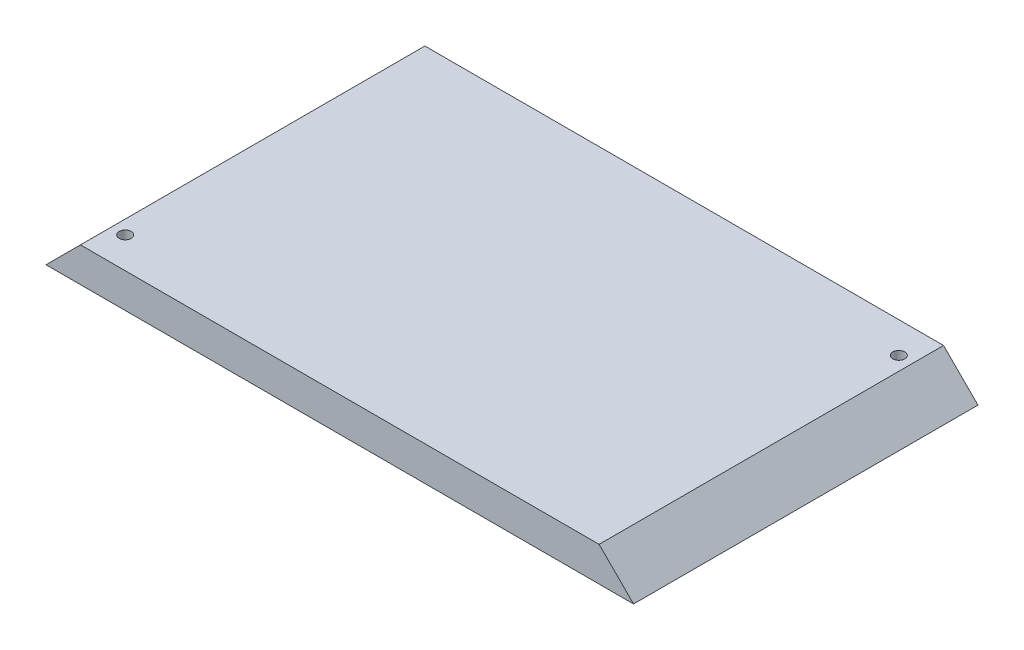
ISO-10303-21;
HEADER;
FILE_DESCRIPTION(('STEP AP214'),'2;1');
FILE_NAME('part.step','',(''),(''),'','','');
FILE_SCHEMA(('AUTOMOTIVE_DESIGN { 1 0 10303 214 1 1 1 1 }'));
ENDSEC;
DATA;
#1=APPLICATION_CONTEXT('core data for automotive mechanical design processes');
#2=APPLICATION_PROTOCOL_DEFINITION('international standard','automotive_design',2000,#1);
#3=PRODUCT_CONTEXT('',#1,'mechanical');
#4=PRODUCT('Part','Part','',(#3));
#5=PRODUCT_RELATED_PRODUCT_CATEGORY('part','',(#4));
#6=PRODUCT_DEFINITION_FORMATION('','',#4);
#7=PRODUCT_DEFINITION_CONTEXT('part definition',#1,'design');
#8=PRODUCT_DEFINITION('design','',#6,#7);
#9=PRODUCT_DEFINITION_SHAPE('','',#8);
#10=(LENGTH_UNIT() NAMED_UNIT(*) SI_UNIT(.MILLI.,.METRE.));
#11=(NAMED_UNIT(*) PLANE_ANGLE_UNIT() SI_UNIT($,.RADIAN.));
#12=(NAMED_UNIT(*) SI_UNIT($,.STERADIAN.) SOLID_ANGLE_UNIT());
#13=UNCERTAINTY_MEASURE_WITH_UNIT(LENGTH_MEASURE(1.E-05),#10,'distance_accuracy_value','');
#14=(GEOMETRIC_REPRESENTATION_CONTEXT(3) GLOBAL_UNCERTAINTY_ASSIGNED_CONTEXT((#13)) GLOBAL_UNIT_ASSIGNED_CONTEXT((#10,
#11,#12)) REPRESENTATION_CONTEXT('',''));
#15=CARTESIAN_POINT('',(0.,0.,0.));
#16=DIRECTION('',(0.,0.,1.));
#17=DIRECTION('',(1.,0.,0.));
#18=AXIS2_PLACEMENT_3D('',#15,#16,#17);
#19=CARTESIAN_POINT('',(-77.02528017,10.,-25.8878283702979));
#20=DIRECTION('',(-0.707106781186546,0.707106781186549,0.));
#21=DIRECTION('',(-0.707106781186549,-0.707106781186546,0.));
#22=AXIS2_PLACEMENT_3D('',#19,#20,#21);
#23=PLANE('',#22);
#24=DIRECTION('',(0.,0.,-1.));
#25=VECTOR('',#24,1.);
#26=CARTESIAN_POINT('',(-87.02528017,0.,-25.8878283702979));
#27=LINE('',#26,#25);
#28=CARTESIAN_POINT('',(-87.02528017,0.,-25.8878283702979));
#29=VERTEX_POINT('',#28);
#30=CARTESIAN_POINT('',(-87.02528017,0.,74.1121716297021));
#31=VERTEX_POINT('',#30);
#32=EDGE_CURVE('E100',#29,#31,#27,.F.);
#33=ORIENTED_EDGE('',*,*,#32,.T.);
#34=DIRECTION('',(0.707106781186549,0.707106781186546,0.));
#35=VECTOR('',#34,1.);
#36=CARTESIAN_POINT('',(-77.02528017,10.,74.1121716297021));
#37=LINE('',#36,#35);
#38=CARTESIAN_POINT('',(-77.02528017,10.,74.1121716297021));
#39=VERTEX_POINT('',#38);
#40=EDGE_CURVE('E11',#39,#31,#37,.F.);
#41=ORIENTED_EDGE('',*,*,#40,.F.);
#42=DIRECTION('',(0.,0.,1.));
#43=VECTOR('',#42,1.);
#44=CARTESIAN_POINT('',(-77.02528017,10.,-25.8878283702979));
#45=LINE('',#44,#43);
#46=CARTESIAN_POINT('',(-77.02528017,10.,-25.8878283702979));
#47=VERTEX_POINT('',#46);
#48=EDGE_CURVE('E81',#47,#39,#45,.T.);
#49=ORIENTED_EDGE('',*,*,#48,.F.);
#50=DIRECTION('',(0.707106781186549,0.707106781186546,0.));
#51=VECTOR('',#50,1.);
#52=CARTESIAN_POINT('',(-77.02528017,10.,-25.8878283702979));
#53=LINE('',#52,#51);
#54=EDGE_CURVE('E94',#47,#29,#53,.F.);
#55=ORIENTED_EDGE('',*,*,#54,.T.);
#56=EDGE_LOOP('',(#33,#41,#49,#55));
#57=FACE_BOUND('',#56,.T.);
#58=ADVANCED_FACE('F33',(#57),#23,.T.);
#59=CARTESIAN_POINT('',(-77.02528017,10.,74.1121716297021));
#60=DIRECTION('',(0.,0.,-1.));
#61=DIRECTION('',(-1.,0.,0.));
#62=AXIS2_PLACEMENT_3D('',#59,#60,#61);
#63=PLANE('',#62);
#64=DIRECTION('',(1.,0.,0.));
#65=VECTOR('',#64,1.);
#66=CARTESIAN_POINT('',(-77.02528017,0.,74.1121716297021));
#67=LINE('',#66,#65);
#68=CARTESIAN_POINT('',(83.5547198300001,0.,74.1121716297021));
#69=VERTEX_POINT('',#68);
#70=EDGE_CURVE('E87',#31,#69,#67,.T.);
#71=ORIENTED_EDGE('',*,*,#70,.T.);
#72=DIRECTION('',(-0.707106781186549,0.707106781186546,0.));
#73=VECTOR('',#72,1.);
#74=CARTESIAN_POINT('',(73.55471983,10.,74.1121716297021));
#75=LINE('',#74,#73);
#76=CARTESIAN_POINT('',(73.55471983,10.,74.1121716297021));
#77=VERTEX_POINT('',#76);
#78=EDGE_CURVE('E42',#77,#69,#75,.F.);
#79=ORIENTED_EDGE('',*,*,#78,.F.);
#80=DIRECTION('',(1.,0.,0.));
#81=VECTOR('',#80,1.);
#82=CARTESIAN_POINT('',(-77.02528017,10.,74.1121716297021));
#83=LINE('',#82,#81);
#84=EDGE_CURVE('E75',#39,#77,#83,.T.);
#85=ORIENTED_EDGE('',*,*,#84,.F.);
#86=ORIENTED_EDGE('',*,*,#40,.T.);
#87=EDGE_LOOP('',(#71,#79,#85,#86));
#88=FACE_BOUND('',#87,.T.);
#89=ADVANCED_FACE('F85',(#88),#63,.F.);
#90=CARTESIAN_POINT('',(73.55471983,10.,-25.8878283702979));
#91=DIRECTION('',(0.707106781186546,0.707106781186549,0.));
#92=DIRECTION('',(-0.707106781186549,0.707106781186546,0.));
#93=AXIS2_PLACEMENT_3D('',#90,#91,#92);
#94=PLANE('',#93);
#95=DIRECTION('',(0.,0.,1.));
#96=VECTOR('',#95,1.);
#97=CARTESIAN_POINT('',(83.55471983,0.,-25.8878283702979));
#98=LINE('',#97,#96);
#99=CARTESIAN_POINT('',(83.55471983,0.,-25.8878283702979));
#100=VERTEX_POINT('',#99);
#101=EDGE_CURVE('E99',#69,#100,#98,.F.);
#102=ORIENTED_EDGE('',*,*,#101,.T.);
#103=DIRECTION('',(-0.707106781186549,0.707106781186546,0.));
#104=VECTOR('',#103,1.);
#105=CARTESIAN_POINT('',(-1.73528017000028,85.29,-25.8878283702979));
#106=LINE('',#105,#104);
#107=CARTESIAN_POINT('',(73.55471983,10.,-25.8878283702979));
#108=VERTEX_POINT('',#107);
#109=EDGE_CURVE('E90',#108,#100,#106,.F.);
#110=ORIENTED_EDGE('',*,*,#109,.F.);
#111=DIRECTION('',(0.,0.,-1.));
#112=VECTOR('',#111,1.);
#113=CARTESIAN_POINT('',(73.55471983,10.,-25.8878283702979));
#114=LINE('',#113,#112);
#115=EDGE_CURVE('E78',#77,#108,#114,.T.);
#116=ORIENTED_EDGE('',*,*,#115,.F.);
#117=ORIENTED_EDGE('',*,*,#78,.T.);
#118=EDGE_LOOP('',(#102,#110,#116,#117));
#119=FACE_BOUND('',#118,.T.);
#120=ADVANCED_FACE('F92',(#119),#94,.T.);
#121=CARTESIAN_POINT('',(-77.02528017,10.,-25.8878283702979));
#122=DIRECTION('',(0.,0.,1.));
#123=DIRECTION('',(1.,0.,0.));
#124=AXIS2_PLACEMENT_3D('',#121,#122,#123);
#125=PLANE('',#124);
#126=DIRECTION('',(-1.,0.,0.));
#127=VECTOR('',#126,1.);
#128=CARTESIAN_POINT('',(-77.02528017,0.,-25.8878283702979));
#129=LINE('',#128,#127);
#130=EDGE_CURVE('E68',#100,#29,#129,.T.);
#131=ORIENTED_EDGE('',*,*,#130,.T.);
#132=ORIENTED_EDGE('',*,*,#54,.F.);
#133=DIRECTION('',(-1.,0.,0.));
#134=VECTOR('',#133,1.);
#135=CARTESIAN_POINT('',(-77.02528017,10.,-25.8878283702979));
#136=LINE('',#135,#134);
#137=EDGE_CURVE('E51',#108,#47,#136,.T.);
#138=ORIENTED_EDGE('',*,*,#137,.F.);
#139=ORIENTED_EDGE('',*,*,#109,.T.);
#140=EDGE_LOOP('',(#131,#132,#138,#139));
#141=FACE_BOUND('',#140,.T.);
#142=ADVANCED_FACE('F127',(#141),#125,.F.);
#143=CARTESIAN_POINT('',(0.,10.,0.));
#144=DIRECTION('',(0.,1.,0.));
#145=DIRECTION('',(0.,0.,1.));
#146=AXIS2_PLACEMENT_3D('',#143,#144,#145);
#147=PLANE('',#146);
#148=CARTESIAN_POINT('',(69.55471983,10.,-16.8878283702979));
#149=DIRECTION('',(0.,1.,0.));
#150=DIRECTION('',(0.,0.,1.));
#151=AXIS2_PLACEMENT_3D('',#148,#149,#150);
#152=CIRCLE('',#151,1.75);
#153=CARTESIAN_POINT('',(69.55471983,10.,-15.1378283702979));
#154=VERTEX_POINT('',#153);
#155=EDGE_CURVE('E116',#154,#154,#152,.T.);
#156=ORIENTED_EDGE('',*,*,#155,.F.);
#157=EDGE_LOOP('',(#156));
#158=FACE_BOUND('',#157,.T.);
#159=CARTESIAN_POINT('',(-73.02528017,10.,65.1121716297022));
#160=DIRECTION('',(0.,1.,0.));
#161=DIRECTION('',(0.,0.,1.));
#162=AXIS2_PLACEMENT_3D('',#159,#160,#161);
#163=CIRCLE('',#162,1.75);
#164=CARTESIAN_POINT('',(-73.02528017,10.,66.8621716297022));
#165=VERTEX_POINT('',#164);
#166=EDGE_CURVE('E108',#165,#165,#163,.T.);
#167=ORIENTED_EDGE('',*,*,#166,.F.);
#168=EDGE_LOOP('',(#167));
#169=FACE_BOUND('',#168,.T.);
#170=ORIENTED_EDGE('',*,*,#48,.T.);
#171=ORIENTED_EDGE('',*,*,#84,.T.);
#172=ORIENTED_EDGE('',*,*,#115,.T.);
#173=ORIENTED_EDGE('',*,*,#137,.T.);
#174=EDGE_LOOP('',(#170,#171,#172,#173));
#175=FACE_BOUND('',#174,.T.);
#176=ADVANCED_FACE('F76',(#158,#169,#175),#147,.T.);
#177=CARTESIAN_POINT('',(0.,0.,0.));
#178=DIRECTION('',(0.,1.,0.));
#179=DIRECTION('',(0.,0.,1.));
#180=AXIS2_PLACEMENT_3D('',#177,#178,#179);
#181=PLANE('',#180);
#182=CARTESIAN_POINT('',(69.55471983,0.,-16.8878283702979));
#183=DIRECTION('',(0.,1.,0.));
#184=DIRECTION('',(0.,0.,1.));
#185=AXIS2_PLACEMENT_3D('',#182,#183,#184);
#186=CIRCLE('',#185,1.75);
#187=CARTESIAN_POINT('',(69.55471983,0.,-15.1378283702979));
#188=VERTEX_POINT('',#187);
#189=EDGE_CURVE('E36',#188,#188,#186,.T.);
#190=ORIENTED_EDGE('',*,*,#189,.T.);
#191=EDGE_LOOP('',(#190));
#192=FACE_BOUND('',#191,.T.);
#193=CARTESIAN_POINT('',(-73.02528017,0.,65.1121716297022));
#194=DIRECTION('',(0.,1.,0.));
#195=DIRECTION('',(0.,0.,1.));
#196=AXIS2_PLACEMENT_3D('',#193,#194,#195);
#197=CIRCLE('',#196,1.75);
#198=CARTESIAN_POINT('',(-73.02528017,0.,66.8621716297022));
#199=VERTEX_POINT('',#198);
#200=EDGE_CURVE('E106',#199,#199,#197,.T.);
#201=ORIENTED_EDGE('',*,*,#200,.T.);
#202=EDGE_LOOP('',(#201));
#203=FACE_BOUND('',#202,.T.);
#204=ORIENTED_EDGE('',*,*,#32,.F.);
#205=ORIENTED_EDGE('',*,*,#130,.F.);
#206=ORIENTED_EDGE('',*,*,#101,.F.);
#207=ORIENTED_EDGE('',*,*,#70,.F.);
#208=EDGE_LOOP('',(#204,#205,#206,#207));
#209=FACE_BOUND('',#208,.T.);
#210=ADVANCED_FACE('F126',(#192,#203,#209),#181,.F.);
#211=CARTESIAN_POINT('',(-73.02528017,-5.,65.1121716297022));
#212=DIRECTION('',(0.,1.,0.));
#213=DIRECTION('',(0.,0.,1.));
#214=AXIS2_PLACEMENT_3D('',#211,#212,#213);
#215=CYLINDRICAL_SURFACE('',#214,1.75);
#216=ORIENTED_EDGE('',*,*,#166,.T.);
#217=EDGE_LOOP('',(#216));
#218=FACE_BOUND('',#217,.T.);
#219=ORIENTED_EDGE('',*,*,#200,.F.);
#220=EDGE_LOOP('',(#219));
#221=FACE_BOUND('',#220,.T.);
#222=ADVANCED_FACE('F133',(#218,#221),#215,.F.);
#223=CARTESIAN_POINT('',(69.55471983,-5.,-16.8878283702979));
#224=DIRECTION('',(0.,1.,0.));
#225=DIRECTION('',(0.,0.,1.));
#226=AXIS2_PLACEMENT_3D('',#223,#224,#225);
#227=CYLINDRICAL_SURFACE('',#226,1.75);
#228=ORIENTED_EDGE('',*,*,#155,.T.);
#229=EDGE_LOOP('',(#228));
#230=FACE_BOUND('',#229,.T.);
#231=ORIENTED_EDGE('',*,*,#189,.F.);
#232=EDGE_LOOP('',(#231));
#233=FACE_BOUND('',#232,.T.);
#234=ADVANCED_FACE('F121',(#230,#233),#227,.F.);
#235=CLOSED_SHELL('',(#58,#89,#120,#142,#176,#210,#222,#234));
#236=MANIFOLD_SOLID_BREP('B2',#235);
#237=ADVANCED_BREP_SHAPE_REPRESENTATION('',(#18,#236),#14);
#238=SHAPE_DEFINITION_REPRESENTATION(#9,#237);
ENDSEC;
END-ISO-10303-21;
